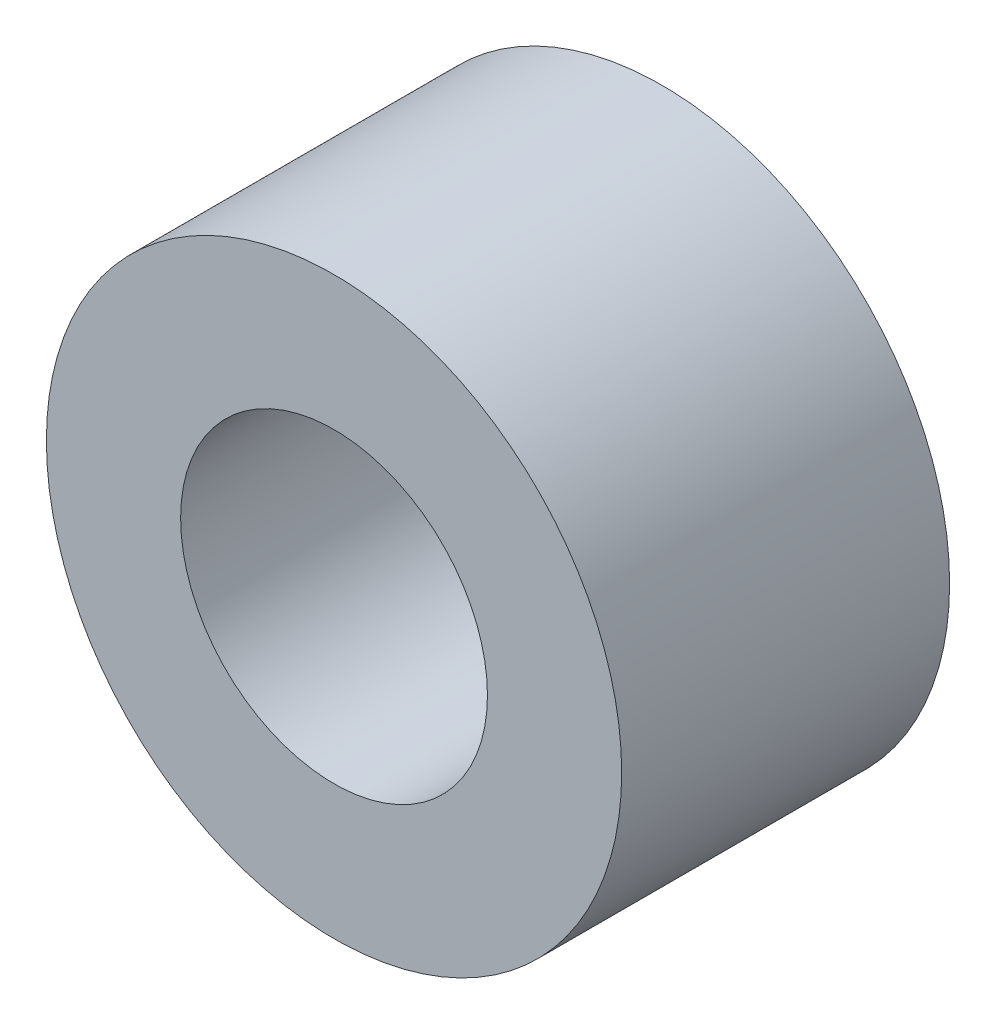
ISO-10303-21;
HEADER;
FILE_DESCRIPTION(('STEP AP214'),'2;1');
FILE_NAME('part.step','',(''),(''),'','','');
FILE_SCHEMA(('AUTOMOTIVE_DESIGN { 1 0 10303 214 1 1 1 1 }'));
ENDSEC;
DATA;
#1=APPLICATION_CONTEXT('core data for automotive mechanical design processes');
#2=APPLICATION_PROTOCOL_DEFINITION('international standard','automotive_design',2000,#1);
#3=PRODUCT_CONTEXT('',#1,'mechanical');
#4=PRODUCT('Part','Part','',(#3));
#5=PRODUCT_RELATED_PRODUCT_CATEGORY('part','',(#4));
#6=PRODUCT_DEFINITION_FORMATION('','',#4);
#7=PRODUCT_DEFINITION_CONTEXT('part definition',#1,'design');
#8=PRODUCT_DEFINITION('design','',#6,#7);
#9=PRODUCT_DEFINITION_SHAPE('','',#8);
#10=(LENGTH_UNIT() NAMED_UNIT(*) SI_UNIT(.MILLI.,.METRE.));
#11=(NAMED_UNIT(*) PLANE_ANGLE_UNIT() SI_UNIT($,.RADIAN.));
#12=(NAMED_UNIT(*) SI_UNIT($,.STERADIAN.) SOLID_ANGLE_UNIT());
#13=UNCERTAINTY_MEASURE_WITH_UNIT(LENGTH_MEASURE(1.E-05),#10,'distance_accuracy_value','');
#14=(GEOMETRIC_REPRESENTATION_CONTEXT(3) GLOBAL_UNCERTAINTY_ASSIGNED_CONTEXT((#13)) GLOBAL_UNIT_ASSIGNED_CONTEXT((#10,
#11,#12)) REPRESENTATION_CONTEXT('',''));
#15=CARTESIAN_POINT('',(0.,0.,0.));
#16=DIRECTION('',(0.,0.,1.));
#17=DIRECTION('',(1.,0.,0.));
#18=AXIS2_PLACEMENT_3D('',#15,#16,#17);
#19=CARTESIAN_POINT('',(0.,0.,3.42));
#20=DIRECTION('',(0.,0.,1.));
#21=DIRECTION('',(1.,0.,0.));
#22=AXIS2_PLACEMENT_3D('',#19,#20,#21);
#23=PLANE('',#22);
#24=CARTESIAN_POINT('',(0.,0.,3.42));
#25=DIRECTION('',(0.,0.,1.));
#26=DIRECTION('',(1.,0.,0.));
#27=AXIS2_PLACEMENT_3D('',#24,#25,#26);
#28=CIRCLE('',#27,6.);
#29=CARTESIAN_POINT('',(6.,0.,3.42));
#30=VERTEX_POINT('',#29);
#31=EDGE_CURVE('E10',#30,#30,#28,.T.);
#32=ORIENTED_EDGE('',*,*,#31,.T.);
#33=EDGE_LOOP('',(#32));
#34=FACE_BOUND('',#33,.T.);
#35=CARTESIAN_POINT('',(0.,0.,3.42));
#36=DIRECTION('',(0.,0.,1.));
#37=DIRECTION('',(1.,0.,0.));
#38=AXIS2_PLACEMENT_3D('',#35,#36,#37);
#39=CIRCLE('',#38,3.2);
#40=CARTESIAN_POINT('',(3.2,0.,3.42));
#41=VERTEX_POINT('',#40);
#42=EDGE_CURVE('E42',#41,#41,#39,.T.);
#43=ORIENTED_EDGE('',*,*,#42,.F.);
#44=EDGE_LOOP('',(#43));
#45=FACE_BOUND('',#44,.T.);
#46=ADVANCED_FACE('F31',(#34,#45),#23,.T.);
#47=CARTESIAN_POINT('',(0.,0.,-3.42));
#48=DIRECTION('',(0.,0.,1.));
#49=DIRECTION('',(1.,0.,0.));
#50=AXIS2_PLACEMENT_3D('',#47,#48,#49);
#51=PLANE('',#50);
#52=CARTESIAN_POINT('',(0.,0.,-3.42));
#53=DIRECTION('',(0.,0.,1.));
#54=DIRECTION('',(1.,0.,0.));
#55=AXIS2_PLACEMENT_3D('',#52,#53,#54);
#56=CIRCLE('',#55,6.);
#57=CARTESIAN_POINT('',(6.,0.,-3.42));
#58=VERTEX_POINT('',#57);
#59=EDGE_CURVE('E35',#58,#58,#56,.T.);
#60=ORIENTED_EDGE('',*,*,#59,.F.);
#61=EDGE_LOOP('',(#60));
#62=FACE_BOUND('',#61,.T.);
#63=CARTESIAN_POINT('',(0.,0.,-3.42));
#64=DIRECTION('',(0.,0.,1.));
#65=DIRECTION('',(1.,0.,0.));
#66=AXIS2_PLACEMENT_3D('',#63,#64,#65);
#67=CIRCLE('',#66,3.2);
#68=CARTESIAN_POINT('',(3.2,0.,-3.42));
#69=VERTEX_POINT('',#68);
#70=EDGE_CURVE('E44',#69,#69,#67,.T.);
#71=ORIENTED_EDGE('',*,*,#70,.T.);
#72=EDGE_LOOP('',(#71));
#73=FACE_BOUND('',#72,.T.);
#74=ADVANCED_FACE('F54',(#62,#73),#51,.F.);
#75=CARTESIAN_POINT('',(0.,0.,3.42));
#76=DIRECTION('',(0.,0.,-1.));
#77=DIRECTION('',(-1.,0.,0.));
#78=AXIS2_PLACEMENT_3D('',#75,#76,#77);
#79=CYLINDRICAL_SURFACE('',#78,6.);
#80=ORIENTED_EDGE('',*,*,#31,.F.);
#81=EDGE_LOOP('',(#80));
#82=FACE_BOUND('',#81,.T.);
#83=ORIENTED_EDGE('',*,*,#59,.T.);
#84=EDGE_LOOP('',(#83));
#85=FACE_BOUND('',#84,.T.);
#86=ADVANCED_FACE('F33',(#82,#85),#79,.T.);
#87=CARTESIAN_POINT('',(0.,0.,3.42));
#88=DIRECTION('',(0.,0.,-1.));
#89=DIRECTION('',(-1.,0.,0.));
#90=AXIS2_PLACEMENT_3D('',#87,#88,#89);
#91=CYLINDRICAL_SURFACE('',#90,3.2);
#92=ORIENTED_EDGE('',*,*,#42,.T.);
#93=EDGE_LOOP('',(#92));
#94=FACE_BOUND('',#93,.T.);
#95=ORIENTED_EDGE('',*,*,#70,.F.);
#96=EDGE_LOOP('',(#95));
#97=FACE_BOUND('',#96,.T.);
#98=ADVANCED_FACE('F50',(#94,#97),#91,.F.);
#99=CLOSED_SHELL('',(#46,#74,#86,#98));
#100=MANIFOLD_SOLID_BREP('B2',#99);
#101=ADVANCED_BREP_SHAPE_REPRESENTATION('',(#18,#100),#14);
#102=SHAPE_DEFINITION_REPRESENTATION(#9,#101);
ENDSEC;
END-ISO-10303-21;
